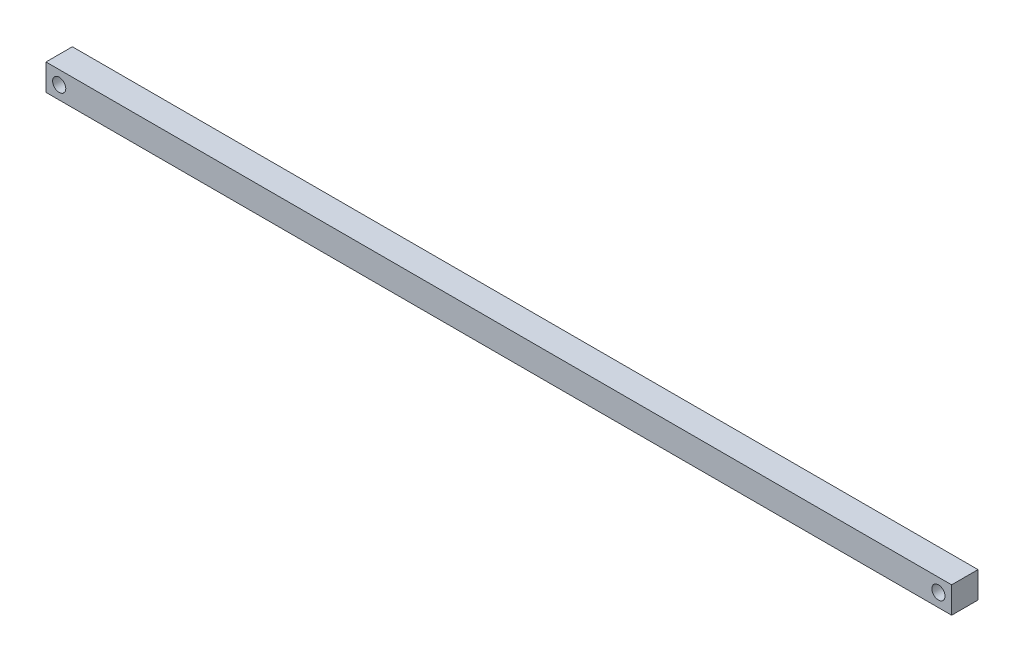
ISO-10303-21;
HEADER;
FILE_DESCRIPTION(('STEP AP214'),'2;1');
FILE_NAME('part.step','',(''),(''),'','','');
FILE_SCHEMA(('AUTOMOTIVE_DESIGN { 1 0 10303 214 1 1 1 1 }'));
ENDSEC;
DATA;
#1=APPLICATION_CONTEXT('core data for automotive mechanical design processes');
#2=APPLICATION_PROTOCOL_DEFINITION('international standard','automotive_design',2000,#1);
#3=PRODUCT_CONTEXT('',#1,'mechanical');
#4=PRODUCT('Part','Part','',(#3));
#5=PRODUCT_RELATED_PRODUCT_CATEGORY('part','',(#4));
#6=PRODUCT_DEFINITION_FORMATION('','',#4);
#7=PRODUCT_DEFINITION_CONTEXT('part definition',#1,'design');
#8=PRODUCT_DEFINITION('design','',#6,#7);
#9=PRODUCT_DEFINITION_SHAPE('','',#8);
#10=(LENGTH_UNIT() NAMED_UNIT(*) SI_UNIT(.MILLI.,.METRE.));
#11=(NAMED_UNIT(*) PLANE_ANGLE_UNIT() SI_UNIT($,.RADIAN.));
#12=(NAMED_UNIT(*) SI_UNIT($,.STERADIAN.) SOLID_ANGLE_UNIT());
#13=UNCERTAINTY_MEASURE_WITH_UNIT(LENGTH_MEASURE(1.E-05),#10,'distance_accuracy_value','');
#14=(GEOMETRIC_REPRESENTATION_CONTEXT(3) GLOBAL_UNCERTAINTY_ASSIGNED_CONTEXT((#13)) GLOBAL_UNIT_ASSIGNED_CONTEXT((#10,
#11,#12)) REPRESENTATION_CONTEXT('',''));
#15=CARTESIAN_POINT('',(0.,0.,0.));
#16=DIRECTION('',(0.,0.,1.));
#17=DIRECTION('',(1.,0.,0.));
#18=AXIS2_PLACEMENT_3D('',#15,#16,#17);
#19=CARTESIAN_POINT('',(0.,0.,15.));
#20=DIRECTION('',(0.,0.,-1.));
#21=DIRECTION('',(-1.,0.,0.));
#22=AXIS2_PLACEMENT_3D('',#19,#20,#21);
#23=PLANE('',#22);
#24=DIRECTION('',(0.,-1.,0.));
#25=VECTOR('',#24,1.);
#26=CARTESIAN_POINT('',(-515.,15.,15.));
#27=LINE('',#26,#25);
#28=CARTESIAN_POINT('',(-515.,15.,15.));
#29=VERTEX_POINT('',#28);
#30=CARTESIAN_POINT('',(-515.,-15.,15.));
#31=VERTEX_POINT('',#30);
#32=EDGE_CURVE('E106',#29,#31,#27,.T.);
#33=ORIENTED_EDGE('',*,*,#32,.T.);
#34=DIRECTION('',(1.,0.,0.));
#35=VECTOR('',#34,1.);
#36=CARTESIAN_POINT('',(515.,-15.,15.));
#37=LINE('',#36,#35);
#38=CARTESIAN_POINT('',(515.,-15.,15.));
#39=VERTEX_POINT('',#38);
#40=EDGE_CURVE('E101',#31,#39,#37,.T.);
#41=ORIENTED_EDGE('',*,*,#40,.T.);
#42=DIRECTION('',(0.,1.,0.));
#43=VECTOR('',#42,1.);
#44=CARTESIAN_POINT('',(515.,15.,15.));
#45=LINE('',#44,#43);
#46=CARTESIAN_POINT('',(515.,15.,15.));
#47=VERTEX_POINT('',#46);
#48=EDGE_CURVE('E104',#39,#47,#45,.T.);
#49=ORIENTED_EDGE('',*,*,#48,.T.);
#50=DIRECTION('',(-1.,0.,0.));
#51=VECTOR('',#50,1.);
#52=CARTESIAN_POINT('',(515.,15.,15.));
#53=LINE('',#52,#51);
#54=EDGE_CURVE('E67',#47,#29,#53,.T.);
#55=ORIENTED_EDGE('',*,*,#54,.T.);
#56=EDGE_LOOP('',(#33,#41,#49,#55));
#57=FACE_BOUND('',#56,.T.);
#58=CARTESIAN_POINT('',(500.,0.,15.));
#59=DIRECTION('',(0.,0.,1.));
#60=DIRECTION('',(1.,0.,0.));
#61=AXIS2_PLACEMENT_3D('',#58,#59,#60);
#62=CIRCLE('',#61,7.50000000000007);
#63=CARTESIAN_POINT('',(507.5,0.,15.));
#64=VERTEX_POINT('',#63);
#65=EDGE_CURVE('E127',#64,#64,#62,.T.);
#66=ORIENTED_EDGE('',*,*,#65,.F.);
#67=EDGE_LOOP('',(#66));
#68=FACE_BOUND('',#67,.T.);
#69=CARTESIAN_POINT('',(-500.,0.,15.));
#70=DIRECTION('',(0.,0.,1.));
#71=DIRECTION('',(1.,0.,0.));
#72=AXIS2_PLACEMENT_3D('',#69,#70,#71);
#73=CIRCLE('',#72,7.50000000000001);
#74=CARTESIAN_POINT('',(-492.5,0.,15.));
#75=VERTEX_POINT('',#74);
#76=EDGE_CURVE('E150',#75,#75,#73,.T.);
#77=ORIENTED_EDGE('',*,*,#76,.F.);
#78=EDGE_LOOP('',(#77));
#79=FACE_BOUND('',#78,.T.);
#80=ADVANCED_FACE('F46',(#57,#68,#79),#23,.F.);
#81=CARTESIAN_POINT('',(0.,0.,-15.));
#82=DIRECTION('',(0.,0.,-1.));
#83=DIRECTION('',(-1.,0.,0.));
#84=AXIS2_PLACEMENT_3D('',#81,#82,#83);
#85=PLANE('',#84);
#86=CARTESIAN_POINT('',(500.,0.,-15.));
#87=DIRECTION('',(0.,0.,1.));
#88=DIRECTION('',(1.,0.,0.));
#89=AXIS2_PLACEMENT_3D('',#86,#87,#88);
#90=CIRCLE('',#89,7.50000000000007);
#91=CARTESIAN_POINT('',(507.5,0.,-15.));
#92=VERTEX_POINT('',#91);
#93=EDGE_CURVE('E147',#92,#92,#90,.T.);
#94=ORIENTED_EDGE('',*,*,#93,.T.);
#95=EDGE_LOOP('',(#94));
#96=FACE_BOUND('',#95,.T.);
#97=DIRECTION('',(0.,-1.,0.));
#98=VECTOR('',#97,1.);
#99=CARTESIAN_POINT('',(-515.,15.,-15.));
#100=LINE('',#99,#98);
#101=CARTESIAN_POINT('',(-515.,15.,-15.));
#102=VERTEX_POINT('',#101);
#103=CARTESIAN_POINT('',(-515.,-15.,-15.));
#104=VERTEX_POINT('',#103);
#105=EDGE_CURVE('E123',#102,#104,#100,.T.);
#106=ORIENTED_EDGE('',*,*,#105,.F.);
#107=DIRECTION('',(-1.,0.,0.));
#108=VECTOR('',#107,1.);
#109=CARTESIAN_POINT('',(515.,15.,-15.));
#110=LINE('',#109,#108);
#111=CARTESIAN_POINT('',(515.,15.,-15.));
#112=VERTEX_POINT('',#111);
#113=EDGE_CURVE('E93',#112,#102,#110,.T.);
#114=ORIENTED_EDGE('',*,*,#113,.F.);
#115=DIRECTION('',(0.,1.,0.));
#116=VECTOR('',#115,1.);
#117=CARTESIAN_POINT('',(515.,15.,-15.));
#118=LINE('',#117,#116);
#119=CARTESIAN_POINT('',(515.,-15.,-15.));
#120=VERTEX_POINT('',#119);
#121=EDGE_CURVE('E87',#120,#112,#118,.T.);
#122=ORIENTED_EDGE('',*,*,#121,.F.);
#123=DIRECTION('',(1.,0.,0.));
#124=VECTOR('',#123,1.);
#125=CARTESIAN_POINT('',(515.,-15.,-15.));
#126=LINE('',#125,#124);
#127=EDGE_CURVE('E111',#104,#120,#126,.T.);
#128=ORIENTED_EDGE('',*,*,#127,.F.);
#129=EDGE_LOOP('',(#106,#114,#122,#128));
#130=FACE_BOUND('',#129,.T.);
#131=CARTESIAN_POINT('',(-500.,0.,-15.));
#132=DIRECTION('',(0.,0.,1.));
#133=DIRECTION('',(1.,0.,0.));
#134=AXIS2_PLACEMENT_3D('',#131,#132,#133);
#135=CIRCLE('',#134,7.50000000000001);
#136=CARTESIAN_POINT('',(-492.5,0.,-15.));
#137=VERTEX_POINT('',#136);
#138=EDGE_CURVE('E153',#137,#137,#135,.T.);
#139=ORIENTED_EDGE('',*,*,#138,.T.);
#140=EDGE_LOOP('',(#139));
#141=FACE_BOUND('',#140,.T.);
#142=ADVANCED_FACE('F141',(#96,#130,#141),#85,.T.);
#143=CARTESIAN_POINT('',(-515.,15.,15.));
#144=DIRECTION('',(1.,0.,0.));
#145=DIRECTION('',(0.,0.,-1.));
#146=AXIS2_PLACEMENT_3D('',#143,#144,#145);
#147=PLANE('',#146);
#148=ORIENTED_EDGE('',*,*,#105,.T.);
#149=DIRECTION('',(0.,0.,-1.));
#150=VECTOR('',#149,1.);
#151=CARTESIAN_POINT('',(-515.,-15.,15.));
#152=LINE('',#151,#150);
#153=EDGE_CURVE('E11',#31,#104,#152,.T.);
#154=ORIENTED_EDGE('',*,*,#153,.F.);
#155=ORIENTED_EDGE('',*,*,#32,.F.);
#156=DIRECTION('',(0.,0.,-1.));
#157=VECTOR('',#156,1.);
#158=CARTESIAN_POINT('',(-515.,15.,15.));
#159=LINE('',#158,#157);
#160=EDGE_CURVE('E119',#29,#102,#159,.T.);
#161=ORIENTED_EDGE('',*,*,#160,.T.);
#162=EDGE_LOOP('',(#148,#154,#155,#161));
#163=FACE_BOUND('',#162,.T.);
#164=ADVANCED_FACE('F48',(#163),#147,.F.);
#165=CARTESIAN_POINT('',(515.,-15.,15.));
#166=DIRECTION('',(0.,1.,0.));
#167=DIRECTION('',(0.,0.,1.));
#168=AXIS2_PLACEMENT_3D('',#165,#166,#167);
#169=PLANE('',#168);
#170=ORIENTED_EDGE('',*,*,#127,.T.);
#171=DIRECTION('',(0.,0.,-1.));
#172=VECTOR('',#171,1.);
#173=CARTESIAN_POINT('',(515.,-15.,15.));
#174=LINE('',#173,#172);
#175=EDGE_CURVE('E56',#39,#120,#174,.T.);
#176=ORIENTED_EDGE('',*,*,#175,.F.);
#177=ORIENTED_EDGE('',*,*,#40,.F.);
#178=ORIENTED_EDGE('',*,*,#153,.T.);
#179=EDGE_LOOP('',(#170,#176,#177,#178));
#180=FACE_BOUND('',#179,.T.);
#181=ADVANCED_FACE('F110',(#180),#169,.F.);
#182=CARTESIAN_POINT('',(515.,15.,15.));
#183=DIRECTION('',(-1.,0.,0.));
#184=DIRECTION('',(0.,0.,1.));
#185=AXIS2_PLACEMENT_3D('',#182,#183,#184);
#186=PLANE('',#185);
#187=ORIENTED_EDGE('',*,*,#121,.T.);
#188=DIRECTION('',(0.,0.,-1.));
#189=VECTOR('',#188,1.);
#190=CARTESIAN_POINT('',(515.,15.,15.));
#191=LINE('',#190,#189);
#192=EDGE_CURVE('E113',#47,#112,#191,.T.);
#193=ORIENTED_EDGE('',*,*,#192,.F.);
#194=ORIENTED_EDGE('',*,*,#48,.F.);
#195=ORIENTED_EDGE('',*,*,#175,.T.);
#196=EDGE_LOOP('',(#187,#193,#194,#195));
#197=FACE_BOUND('',#196,.T.);
#198=ADVANCED_FACE('F114',(#197),#186,.F.);
#199=CARTESIAN_POINT('',(515.,15.,15.));
#200=DIRECTION('',(0.,-1.,0.));
#201=DIRECTION('',(1.,0.,0.));
#202=AXIS2_PLACEMENT_3D('',#199,#200,#201);
#203=PLANE('',#202);
#204=ORIENTED_EDGE('',*,*,#113,.T.);
#205=ORIENTED_EDGE('',*,*,#160,.F.);
#206=ORIENTED_EDGE('',*,*,#54,.F.);
#207=ORIENTED_EDGE('',*,*,#192,.T.);
#208=EDGE_LOOP('',(#204,#205,#206,#207));
#209=FACE_BOUND('',#208,.T.);
#210=ADVANCED_FACE('F138',(#209),#203,.F.);
#211=CARTESIAN_POINT('',(500.,0.,15.));
#212=DIRECTION('',(0.,0.,-1.));
#213=DIRECTION('',(-1.,0.,0.));
#214=AXIS2_PLACEMENT_3D('',#211,#212,#213);
#215=CYLINDRICAL_SURFACE('',#214,7.50000000000007);
#216=ORIENTED_EDGE('',*,*,#65,.T.);
#217=EDGE_LOOP('',(#216));
#218=FACE_BOUND('',#217,.T.);
#219=ORIENTED_EDGE('',*,*,#93,.F.);
#220=EDGE_LOOP('',(#219));
#221=FACE_BOUND('',#220,.T.);
#222=ADVANCED_FACE('F171',(#218,#221),#215,.F.);
#223=CARTESIAN_POINT('',(-500.,0.,15.));
#224=DIRECTION('',(0.,0.,-1.));
#225=DIRECTION('',(-1.,0.,0.));
#226=AXIS2_PLACEMENT_3D('',#223,#224,#225);
#227=CYLINDRICAL_SURFACE('',#226,7.50000000000001);
#228=ORIENTED_EDGE('',*,*,#76,.T.);
#229=EDGE_LOOP('',(#228));
#230=FACE_BOUND('',#229,.T.);
#231=ORIENTED_EDGE('',*,*,#138,.F.);
#232=EDGE_LOOP('',(#231));
#233=FACE_BOUND('',#232,.T.);
#234=ADVANCED_FACE('F160',(#230,#233),#227,.F.);
#235=CLOSED_SHELL('',(#80,#142,#164,#181,#198,#210,#222,#234));
#236=MANIFOLD_SOLID_BREP('B2',#235);
#237=ADVANCED_BREP_SHAPE_REPRESENTATION('',(#18,#236),#14);
#238=SHAPE_DEFINITION_REPRESENTATION(#9,#237);
ENDSEC;
END-ISO-10303-21;
